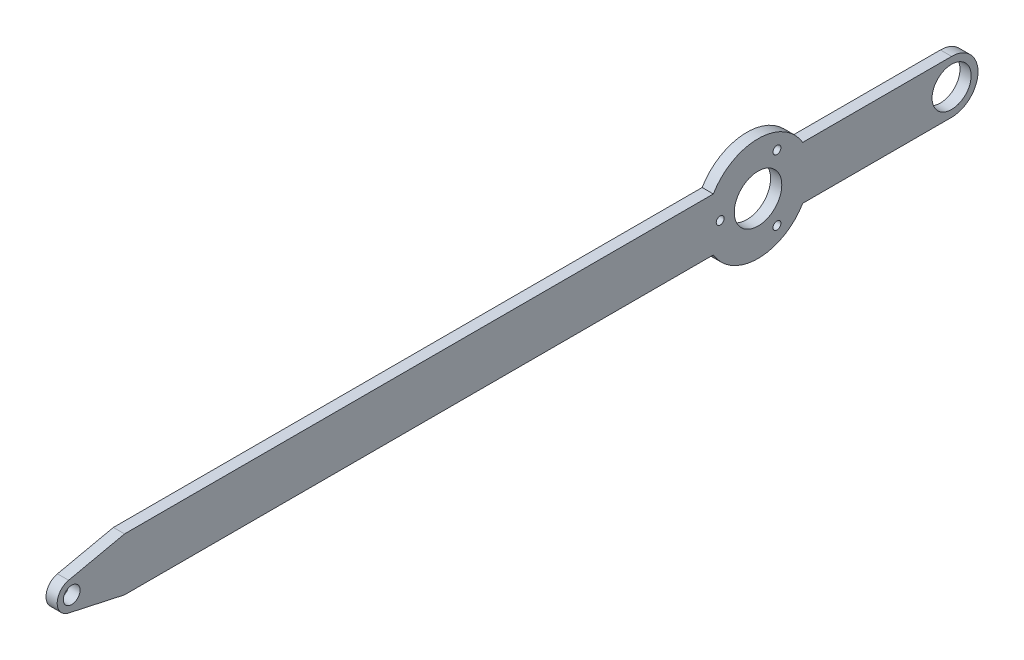
ISO-10303-21;
HEADER;
FILE_DESCRIPTION(('STEP AP214'),'2;1');
FILE_NAME('part.step','',(''),(''),'','','');
FILE_SCHEMA(('AUTOMOTIVE_DESIGN { 1 0 10303 214 1 1 1 1 }'));
ENDSEC;
DATA;
#1=APPLICATION_CONTEXT('core data for automotive mechanical design processes');
#2=APPLICATION_PROTOCOL_DEFINITION('international standard','automotive_design',2000,#1);
#3=PRODUCT_CONTEXT('',#1,'mechanical');
#4=PRODUCT('Part','Part','',(#3));
#5=PRODUCT_RELATED_PRODUCT_CATEGORY('part','',(#4));
#6=PRODUCT_DEFINITION_FORMATION('','',#4);
#7=PRODUCT_DEFINITION_CONTEXT('part definition',#1,'design');
#8=PRODUCT_DEFINITION('design','',#6,#7);
#9=PRODUCT_DEFINITION_SHAPE('','',#8);
#10=(LENGTH_UNIT() NAMED_UNIT(*) SI_UNIT(.MILLI.,.METRE.));
#11=(NAMED_UNIT(*) PLANE_ANGLE_UNIT() SI_UNIT($,.RADIAN.));
#12=(NAMED_UNIT(*) SI_UNIT($,.STERADIAN.) SOLID_ANGLE_UNIT());
#13=UNCERTAINTY_MEASURE_WITH_UNIT(LENGTH_MEASURE(1.E-05),#10,'distance_accuracy_value','');
#14=(GEOMETRIC_REPRESENTATION_CONTEXT(3) GLOBAL_UNCERTAINTY_ASSIGNED_CONTEXT((#13)) GLOBAL_UNIT_ASSIGNED_CONTEXT((#10,
#11,#12)) REPRESENTATION_CONTEXT('',''));
#15=CARTESIAN_POINT('',(0.,0.,0.));
#16=DIRECTION('',(0.,0.,1.));
#17=DIRECTION('',(1.,0.,0.));
#18=AXIS2_PLACEMENT_3D('',#15,#16,#17);
#19=CARTESIAN_POINT('',(3.175,112.17468780522,24.4662503709211));
#20=DIRECTION('',(0.,-0.977030682658923,-0.213098674662794));
#21=DIRECTION('',(0.,0.213098674662794,-0.977030682658923));
#22=AXIS2_PLACEMENT_3D('',#19,#20,#21);
#23=PLANE('',#22);
#24=DIRECTION('',(0.,-0.213098674662794,0.977030682658923));
#25=VECTOR('',#24,1.);
#26=CARTESIAN_POINT('',(-3.175,112.17468780522,24.4662503709211));
#27=LINE('',#26,#25);
#28=CARTESIAN_POINT('',(-3.175,15.,470.));
#29=VERTEX_POINT('',#28);
#30=CARTESIAN_POINT('',(-3.175,8.07271601546937,501.760727799401));
#31=VERTEX_POINT('',#30);
#32=EDGE_CURVE('E154',#29,#31,#27,.T.);
#33=ORIENTED_EDGE('',*,*,#32,.T.);
#34=DIRECTION('',(-1.,0.,0.));
#35=VECTOR('',#34,1.);
#36=CARTESIAN_POINT('',(3.175,8.07271601546937,501.760727799401));
#37=LINE('',#36,#35);
#38=CARTESIAN_POINT('',(3.175,8.07271601546937,501.760727799401));
#39=VERTEX_POINT('',#38);
#40=EDGE_CURVE('E11',#39,#31,#37,.T.);
#41=ORIENTED_EDGE('',*,*,#40,.F.);
#42=DIRECTION('',(0.,-0.213098674662794,0.977030682658923));
#43=VECTOR('',#42,1.);
#44=CARTESIAN_POINT('',(3.175,112.17468780522,24.4662503709211));
#45=LINE('',#44,#43);
#46=CARTESIAN_POINT('',(3.175,15.,470.));
#47=VERTEX_POINT('',#46);
#48=EDGE_CURVE('E228',#47,#39,#45,.T.);
#49=ORIENTED_EDGE('',*,*,#48,.F.);
#50=DIRECTION('',(-1.,0.,0.));
#51=VECTOR('',#50,1.);
#52=CARTESIAN_POINT('',(3.175,15.,470.));
#53=LINE('',#52,#51);
#54=EDGE_CURVE('E50',#47,#29,#53,.T.);
#55=ORIENTED_EDGE('',*,*,#54,.T.);
#56=EDGE_LOOP('',(#33,#41,#49,#55));
#57=FACE_BOUND('',#56,.T.);
#58=ADVANCED_FACE('F33',(#57),#23,.F.);
#59=CARTESIAN_POINT('',(3.175,0.,500.));
#60=DIRECTION('',(-1.,0.,0.));
#61=DIRECTION('',(0.,0.,1.));
#62=AXIS2_PLACEMENT_3D('',#59,#60,#61);
#63=CYLINDRICAL_SURFACE('',#62,8.26250000000001);
#64=CARTESIAN_POINT('',(-3.175,0.,500.));
#65=DIRECTION('',(1.,0.,0.));
#66=DIRECTION('',(0.,0.,-1.));
#67=AXIS2_PLACEMENT_3D('',#64,#65,#66);
#68=CIRCLE('',#67,8.26250000000001);
#69=CARTESIAN_POINT('',(-3.175,-8.07271601546936,501.760727799401));
#70=VERTEX_POINT('',#69);
#71=EDGE_CURVE('E157',#31,#70,#68,.T.);
#72=ORIENTED_EDGE('',*,*,#71,.T.);
#73=DIRECTION('',(-1.,0.,0.));
#74=VECTOR('',#73,1.);
#75=CARTESIAN_POINT('',(3.175,-8.07271601546936,501.760727799401));
#76=LINE('',#75,#74);
#77=CARTESIAN_POINT('',(3.175,-8.07271601546936,501.760727799401));
#78=VERTEX_POINT('',#77);
#79=EDGE_CURVE('E42',#78,#70,#76,.T.);
#80=ORIENTED_EDGE('',*,*,#79,.F.);
#81=CARTESIAN_POINT('',(3.175,0.,500.));
#82=DIRECTION('',(1.,0.,0.));
#83=DIRECTION('',(0.,0.,-1.));
#84=AXIS2_PLACEMENT_3D('',#81,#82,#83);
#85=CIRCLE('',#84,8.26250000000001);
#86=EDGE_CURVE('E95',#39,#78,#85,.T.);
#87=ORIENTED_EDGE('',*,*,#86,.F.);
#88=ORIENTED_EDGE('',*,*,#40,.T.);
#89=EDGE_LOOP('',(#72,#80,#87,#88));
#90=FACE_BOUND('',#89,.T.);
#91=ADVANCED_FACE('F204',(#90),#63,.T.);
#92=CARTESIAN_POINT('',(3.175,-112.17468780522,24.4662503709211));
#93=DIRECTION('',(0.,-0.977030682658923,0.213098674662795));
#94=DIRECTION('',(0.,-0.213098674662795,-0.977030682658923));
#95=AXIS2_PLACEMENT_3D('',#92,#93,#94);
#96=PLANE('',#95);
#97=DIRECTION('',(0.,0.213098674662795,0.977030682658923));
#98=VECTOR('',#97,1.);
#99=CARTESIAN_POINT('',(-3.175,-112.17468780522,24.4662503709211));
#100=LINE('',#99,#98);
#101=CARTESIAN_POINT('',(-3.175,-15.,470.));
#102=VERTEX_POINT('',#101);
#103=EDGE_CURVE('E160',#102,#70,#100,.T.);
#104=ORIENTED_EDGE('',*,*,#103,.F.);
#105=DIRECTION('',(-1.,0.,0.));
#106=VECTOR('',#105,1.);
#107=CARTESIAN_POINT('',(3.175,-15.,470.));
#108=LINE('',#107,#106);
#109=CARTESIAN_POINT('',(3.175,-15.,470.));
#110=VERTEX_POINT('',#109);
#111=EDGE_CURVE('E197',#110,#102,#108,.T.);
#112=ORIENTED_EDGE('',*,*,#111,.F.);
#113=DIRECTION('',(0.,0.213098674662795,0.977030682658923));
#114=VECTOR('',#113,1.);
#115=CARTESIAN_POINT('',(3.175,-112.17468780522,24.4662503709211));
#116=LINE('',#115,#114);
#117=EDGE_CURVE('E203',#110,#78,#116,.T.);
#118=ORIENTED_EDGE('',*,*,#117,.T.);
#119=ORIENTED_EDGE('',*,*,#79,.T.);
#120=EDGE_LOOP('',(#104,#112,#118,#119));
#121=FACE_BOUND('',#120,.T.);
#122=ADVANCED_FACE('F201',(#121),#96,.T.);
#123=CARTESIAN_POINT('',(3.175,-15.,0.));
#124=DIRECTION('',(0.,1.,0.));
#125=DIRECTION('',(0.,0.,1.));
#126=AXIS2_PLACEMENT_3D('',#123,#124,#125);
#127=PLANE('',#126);
#128=DIRECTION('',(0.,0.,-1.));
#129=VECTOR('',#128,1.);
#130=CARTESIAN_POINT('',(-3.175,-15.,0.));
#131=LINE('',#130,#129);
#132=CARTESIAN_POINT('',(-3.175,-15.,135.401771591761));
#133=VERTEX_POINT('',#132);
#134=EDGE_CURVE('E163',#102,#133,#131,.T.);
#135=ORIENTED_EDGE('',*,*,#134,.T.);
#136=DIRECTION('',(-1.,0.,0.));
#137=VECTOR('',#136,1.);
#138=CARTESIAN_POINT('',(3.175,-15.,135.401771591761));
#139=LINE('',#138,#137);
#140=CARTESIAN_POINT('',(3.175,-15.,135.401771591761));
#141=VERTEX_POINT('',#140);
#142=EDGE_CURVE('E194',#141,#133,#139,.T.);
#143=ORIENTED_EDGE('',*,*,#142,.F.);
#144=DIRECTION('',(0.,0.,-1.));
#145=VECTOR('',#144,1.);
#146=CARTESIAN_POINT('',(3.175,-15.,0.));
#147=LINE('',#146,#145);
#148=EDGE_CURVE('E222',#110,#141,#147,.T.);
#149=ORIENTED_EDGE('',*,*,#148,.F.);
#150=ORIENTED_EDGE('',*,*,#111,.T.);
#151=EDGE_LOOP('',(#135,#143,#149,#150));
#152=FACE_BOUND('',#151,.T.);
#153=ADVANCED_FACE('F214',(#152),#127,.F.);
#154=CARTESIAN_POINT('',(3.175,0.,110.));
#155=DIRECTION('',(-1.,0.,0.));
#156=DIRECTION('',(0.,0.,1.));
#157=AXIS2_PLACEMENT_3D('',#154,#155,#156);
#158=CYLINDRICAL_SURFACE('',#157,29.5);
#159=CARTESIAN_POINT('',(-3.175,0.,110.));
#160=DIRECTION('',(1.,0.,0.));
#161=DIRECTION('',(0.,0.,-1.));
#162=AXIS2_PLACEMENT_3D('',#159,#160,#161);
#163=CIRCLE('',#162,29.5);
#164=CARTESIAN_POINT('',(-3.175,-15.,84.5982284082389));
#165=VERTEX_POINT('',#164);
#166=EDGE_CURVE('E165',#133,#165,#163,.T.);
#167=ORIENTED_EDGE('',*,*,#166,.T.);
#168=DIRECTION('',(-1.,0.,0.));
#169=VECTOR('',#168,1.);
#170=CARTESIAN_POINT('',(3.175,-15.,84.5982284082389));
#171=LINE('',#170,#169);
#172=CARTESIAN_POINT('',(3.175,-15.,84.5982284082389));
#173=VERTEX_POINT('',#172);
#174=EDGE_CURVE('E191',#173,#165,#171,.T.);
#175=ORIENTED_EDGE('',*,*,#174,.F.);
#176=CARTESIAN_POINT('',(3.175,0.,110.));
#177=DIRECTION('',(1.,0.,0.));
#178=DIRECTION('',(0.,0.,-1.));
#179=AXIS2_PLACEMENT_3D('',#176,#177,#178);
#180=CIRCLE('',#179,29.5);
#181=EDGE_CURVE('E220',#141,#173,#180,.T.);
#182=ORIENTED_EDGE('',*,*,#181,.F.);
#183=ORIENTED_EDGE('',*,*,#142,.T.);
#184=EDGE_LOOP('',(#167,#175,#182,#183));
#185=FACE_BOUND('',#184,.T.);
#186=ADVANCED_FACE('F218',(#185),#158,.T.);
#187=CARTESIAN_POINT('',(3.175,-15.,0.));
#188=DIRECTION('',(0.,1.,0.));
#189=DIRECTION('',(0.,0.,1.));
#190=AXIS2_PLACEMENT_3D('',#187,#188,#189);
#191=PLANE('',#190);
#192=DIRECTION('',(0.,0.,-1.));
#193=VECTOR('',#192,1.);
#194=CARTESIAN_POINT('',(-3.175,-15.,0.));
#195=LINE('',#194,#193);
#196=CARTESIAN_POINT('',(-3.175,-15.,0.));
#197=VERTEX_POINT('',#196);
#198=EDGE_CURVE('E167',#165,#197,#195,.T.);
#199=ORIENTED_EDGE('',*,*,#198,.T.);
#200=DIRECTION('',(-1.,0.,0.));
#201=VECTOR('',#200,1.);
#202=CARTESIAN_POINT('',(3.175,-15.,0.));
#203=LINE('',#202,#201);
#204=CARTESIAN_POINT('',(3.175,-15.,0.));
#205=VERTEX_POINT('',#204);
#206=EDGE_CURVE('E189',#205,#197,#203,.T.);
#207=ORIENTED_EDGE('',*,*,#206,.F.);
#208=DIRECTION('',(0.,0.,-1.));
#209=VECTOR('',#208,1.);
#210=CARTESIAN_POINT('',(3.175,-15.,0.));
#211=LINE('',#210,#209);
#212=EDGE_CURVE('E140',#173,#205,#211,.T.);
#213=ORIENTED_EDGE('',*,*,#212,.F.);
#214=ORIENTED_EDGE('',*,*,#174,.T.);
#215=EDGE_LOOP('',(#199,#207,#213,#214));
#216=FACE_BOUND('',#215,.T.);
#217=ADVANCED_FACE('F291',(#216),#191,.F.);
#218=CARTESIAN_POINT('',(3.175,0.,0.));
#219=DIRECTION('',(-1.,0.,0.));
#220=DIRECTION('',(0.,0.,1.));
#221=AXIS2_PLACEMENT_3D('',#218,#219,#220);
#222=CYLINDRICAL_SURFACE('',#221,15.);
#223=CARTESIAN_POINT('',(-3.175,0.,0.));
#224=DIRECTION('',(1.,0.,0.));
#225=DIRECTION('',(0.,0.,-1.));
#226=AXIS2_PLACEMENT_3D('',#223,#224,#225);
#227=CIRCLE('',#226,15.);
#228=CARTESIAN_POINT('',(-3.175,15.,0.));
#229=VERTEX_POINT('',#228);
#230=EDGE_CURVE('E170',#229,#197,#227,.F.);
#231=ORIENTED_EDGE('',*,*,#230,.F.);
#232=DIRECTION('',(-1.,0.,0.));
#233=VECTOR('',#232,1.);
#234=CARTESIAN_POINT('',(3.175,15.,0.));
#235=LINE('',#234,#233);
#236=CARTESIAN_POINT('',(3.175,15.,0.));
#237=VERTEX_POINT('',#236);
#238=EDGE_CURVE('E126',#237,#229,#235,.T.);
#239=ORIENTED_EDGE('',*,*,#238,.F.);
#240=CARTESIAN_POINT('',(3.175,0.,0.));
#241=DIRECTION('',(1.,0.,0.));
#242=DIRECTION('',(0.,0.,-1.));
#243=AXIS2_PLACEMENT_3D('',#240,#241,#242);
#244=CIRCLE('',#243,15.);
#245=EDGE_CURVE('E138',#237,#205,#244,.F.);
#246=ORIENTED_EDGE('',*,*,#245,.T.);
#247=ORIENTED_EDGE('',*,*,#206,.T.);
#248=EDGE_LOOP('',(#231,#239,#246,#247));
#249=FACE_BOUND('',#248,.T.);
#250=ADVANCED_FACE('F294',(#249),#222,.T.);
#251=CARTESIAN_POINT('',(3.175,15.,0.));
#252=DIRECTION('',(0.,1.,0.));
#253=DIRECTION('',(0.,0.,1.));
#254=AXIS2_PLACEMENT_3D('',#251,#252,#253);
#255=PLANE('',#254);
#256=DIRECTION('',(0.,0.,-1.));
#257=VECTOR('',#256,1.);
#258=CARTESIAN_POINT('',(-3.175,15.,0.));
#259=LINE('',#258,#257);
#260=CARTESIAN_POINT('',(-3.175,15.,84.5982284082389));
#261=VERTEX_POINT('',#260);
#262=EDGE_CURVE('E123',#261,#229,#259,.T.);
#263=ORIENTED_EDGE('',*,*,#262,.F.);
#264=DIRECTION('',(-1.,0.,0.));
#265=VECTOR('',#264,1.);
#266=CARTESIAN_POINT('',(3.175,15.,84.5982284082389));
#267=LINE('',#266,#265);
#268=CARTESIAN_POINT('',(3.175,15.,84.5982284082389));
#269=VERTEX_POINT('',#268);
#270=EDGE_CURVE('E117',#269,#261,#267,.T.);
#271=ORIENTED_EDGE('',*,*,#270,.F.);
#272=DIRECTION('',(0.,0.,-1.));
#273=VECTOR('',#272,1.);
#274=CARTESIAN_POINT('',(3.175,15.,0.));
#275=LINE('',#274,#273);
#276=EDGE_CURVE('E121',#269,#237,#275,.T.);
#277=ORIENTED_EDGE('',*,*,#276,.T.);
#278=ORIENTED_EDGE('',*,*,#238,.T.);
#279=EDGE_LOOP('',(#263,#271,#277,#278));
#280=FACE_BOUND('',#279,.T.);
#281=ADVANCED_FACE('F119',(#280),#255,.T.);
#282=CARTESIAN_POINT('',(3.175,0.,110.));
#283=DIRECTION('',(-1.,0.,0.));
#284=DIRECTION('',(0.,0.,1.));
#285=AXIS2_PLACEMENT_3D('',#282,#283,#284);
#286=CYLINDRICAL_SURFACE('',#285,29.5);
#287=CARTESIAN_POINT('',(-3.175,0.,110.));
#288=DIRECTION('',(1.,0.,0.));
#289=DIRECTION('',(0.,0.,-1.));
#290=AXIS2_PLACEMENT_3D('',#287,#288,#289);
#291=CIRCLE('',#290,29.5);
#292=CARTESIAN_POINT('',(-3.175,15.,135.401771591761));
#293=VERTEX_POINT('',#292);
#294=EDGE_CURVE('E174',#261,#293,#291,.T.);
#295=ORIENTED_EDGE('',*,*,#294,.T.);
#296=DIRECTION('',(-1.,0.,0.));
#297=VECTOR('',#296,1.);
#298=CARTESIAN_POINT('',(3.175,15.,135.401771591761));
#299=LINE('',#298,#297);
#300=CARTESIAN_POINT('',(3.175,15.,135.401771591761));
#301=VERTEX_POINT('',#300);
#302=EDGE_CURVE('E83',#301,#293,#299,.T.);
#303=ORIENTED_EDGE('',*,*,#302,.F.);
#304=CARTESIAN_POINT('',(3.175,0.,110.));
#305=DIRECTION('',(1.,0.,0.));
#306=DIRECTION('',(0.,0.,-1.));
#307=AXIS2_PLACEMENT_3D('',#304,#305,#306);
#308=CIRCLE('',#307,29.5);
#309=EDGE_CURVE('E128',#269,#301,#308,.T.);
#310=ORIENTED_EDGE('',*,*,#309,.F.);
#311=ORIENTED_EDGE('',*,*,#270,.T.);
#312=EDGE_LOOP('',(#295,#303,#310,#311));
#313=FACE_BOUND('',#312,.T.);
#314=ADVANCED_FACE('F129',(#313),#286,.T.);
#315=CARTESIAN_POINT('',(3.175,0.,110.));
#316=DIRECTION('',(-1.,0.,0.));
#317=DIRECTION('',(0.,0.,1.));
#318=AXIS2_PLACEMENT_3D('',#315,#316,#317);
#319=CYLINDRICAL_SURFACE('',#318,13.5);
#320=CARTESIAN_POINT('',(3.175,0.,110.));
#321=DIRECTION('',(1.,0.,0.));
#322=DIRECTION('',(0.,0.,-1.));
#323=AXIS2_PLACEMENT_3D('',#320,#321,#322);
#324=CIRCLE('',#323,13.5);
#325=CARTESIAN_POINT('',(3.175,0.,96.5));
#326=VERTEX_POINT('',#325);
#327=EDGE_CURVE('E145',#326,#326,#324,.T.);
#328=ORIENTED_EDGE('',*,*,#327,.T.);
#329=EDGE_LOOP('',(#328));
#330=FACE_BOUND('',#329,.T.);
#331=CARTESIAN_POINT('',(-3.175,0.,110.));
#332=DIRECTION('',(1.,0.,0.));
#333=DIRECTION('',(0.,0.,-1.));
#334=AXIS2_PLACEMENT_3D('',#331,#332,#333);
#335=CIRCLE('',#334,13.5);
#336=CARTESIAN_POINT('',(-3.175,0.,96.5));
#337=VERTEX_POINT('',#336);
#338=EDGE_CURVE('E179',#337,#337,#335,.T.);
#339=ORIENTED_EDGE('',*,*,#338,.F.);
#340=EDGE_LOOP('',(#339));
#341=FACE_BOUND('',#340,.T.);
#342=ADVANCED_FACE('F303',(#330,#341),#319,.F.);
#343=CARTESIAN_POINT('',(3.175,15.,0.));
#344=DIRECTION('',(0.,1.,0.));
#345=DIRECTION('',(0.,0.,1.));
#346=AXIS2_PLACEMENT_3D('',#343,#344,#345);
#347=PLANE('',#346);
#348=DIRECTION('',(0.,0.,-1.));
#349=VECTOR('',#348,1.);
#350=CARTESIAN_POINT('',(-3.175,15.,0.));
#351=LINE('',#350,#349);
#352=EDGE_CURVE('E176',#29,#293,#351,.T.);
#353=ORIENTED_EDGE('',*,*,#352,.F.);
#354=ORIENTED_EDGE('',*,*,#54,.F.);
#355=DIRECTION('',(0.,0.,-1.));
#356=VECTOR('',#355,1.);
#357=CARTESIAN_POINT('',(3.175,15.,0.));
#358=LINE('',#357,#356);
#359=EDGE_CURVE('E132',#47,#301,#358,.T.);
#360=ORIENTED_EDGE('',*,*,#359,.T.);
#361=ORIENTED_EDGE('',*,*,#302,.T.);
#362=EDGE_LOOP('',(#353,#354,#360,#361));
#363=FACE_BOUND('',#362,.T.);
#364=ADVANCED_FACE('F264',(#363),#347,.T.);
#365=CARTESIAN_POINT('',(3.175,0.,500.));
#366=DIRECTION('',(-1.,0.,0.));
#367=DIRECTION('',(0.,0.,1.));
#368=AXIS2_PLACEMENT_3D('',#365,#366,#367);
#369=CYLINDRICAL_SURFACE('',#368,4.76250000000001);
#370=CARTESIAN_POINT('',(3.175,0.,500.));
#371=DIRECTION('',(1.,0.,0.));
#372=DIRECTION('',(0.,0.,-1.));
#373=AXIS2_PLACEMENT_3D('',#370,#371,#372);
#374=CIRCLE('',#373,4.76250000000001);
#375=CARTESIAN_POINT('',(3.175,0.,495.2375));
#376=VERTEX_POINT('',#375);
#377=EDGE_CURVE('E185',#376,#376,#374,.T.);
#378=ORIENTED_EDGE('',*,*,#377,.T.);
#379=EDGE_LOOP('',(#378));
#380=FACE_BOUND('',#379,.T.);
#381=CARTESIAN_POINT('',(-3.175,0.,500.));
#382=DIRECTION('',(1.,0.,0.));
#383=DIRECTION('',(0.,0.,-1.));
#384=AXIS2_PLACEMENT_3D('',#381,#382,#383);
#385=CIRCLE('',#384,4.76250000000001);
#386=CARTESIAN_POINT('',(-3.175,0.,495.2375));
#387=VERTEX_POINT('',#386);
#388=EDGE_CURVE('E151',#387,#387,#385,.T.);
#389=ORIENTED_EDGE('',*,*,#388,.F.);
#390=EDGE_LOOP('',(#389));
#391=FACE_BOUND('',#390,.T.);
#392=ADVANCED_FACE('F35',(#380,#391),#369,.F.);
#393=CARTESIAN_POINT('',(3.175,0.,0.));
#394=DIRECTION('',(-1.,0.,0.));
#395=DIRECTION('',(0.,0.,1.));
#396=AXIS2_PLACEMENT_3D('',#393,#394,#395);
#397=CYLINDRICAL_SURFACE('',#396,11.1125);
#398=CARTESIAN_POINT('',(3.175,0.,0.));
#399=DIRECTION('',(1.,0.,0.));
#400=DIRECTION('',(0.,0.,-1.));
#401=AXIS2_PLACEMENT_3D('',#398,#399,#400);
#402=CIRCLE('',#401,11.1125);
#403=CARTESIAN_POINT('',(3.175,0.,-11.1125));
#404=VERTEX_POINT('',#403);
#405=EDGE_CURVE('E148',#404,#404,#402,.T.);
#406=ORIENTED_EDGE('',*,*,#405,.T.);
#407=EDGE_LOOP('',(#406));
#408=FACE_BOUND('',#407,.T.);
#409=CARTESIAN_POINT('',(-3.175,0.,0.));
#410=DIRECTION('',(1.,0.,0.));
#411=DIRECTION('',(0.,0.,-1.));
#412=AXIS2_PLACEMENT_3D('',#409,#410,#411);
#413=CIRCLE('',#412,11.1125);
#414=CARTESIAN_POINT('',(-3.175,0.,-11.1125));
#415=VERTEX_POINT('',#414);
#416=EDGE_CURVE('E182',#415,#415,#413,.T.);
#417=ORIENTED_EDGE('',*,*,#416,.F.);
#418=EDGE_LOOP('',(#417));
#419=FACE_BOUND('',#418,.T.);
#420=ADVANCED_FACE('F254',(#408,#419),#397,.F.);
#421=CARTESIAN_POINT('',(3.175,0.,0.));
#422=DIRECTION('',(1.,0.,0.));
#423=DIRECTION('',(0.,0.,-1.));
#424=AXIS2_PLACEMENT_3D('',#421,#422,#423);
#425=PLANE('',#424);
#426=CARTESIAN_POINT('',(3.175,0.,131.5));
#427=DIRECTION('',(1.,0.,0.));
#428=DIRECTION('',(0.,0.,-1.));
#429=AXIS2_PLACEMENT_3D('',#426,#427,#428);
#430=CIRCLE('',#429,2.25);
#431=CARTESIAN_POINT('',(3.175,0.,129.25));
#432=VERTEX_POINT('',#431);
#433=EDGE_CURVE('E246',#432,#432,#430,.T.);
#434=ORIENTED_EDGE('',*,*,#433,.F.);
#435=EDGE_LOOP('',(#434));
#436=FACE_BOUND('',#435,.T.);
#437=CARTESIAN_POINT('',(3.175,18.6195461813654,99.25));
#438=DIRECTION('',(1.,0.,0.));
#439=DIRECTION('',(0.,0.,-1.));
#440=AXIS2_PLACEMENT_3D('',#437,#438,#439);
#441=CIRCLE('',#440,2.25);
#442=CARTESIAN_POINT('',(3.175,18.6195461813654,97.));
#443=VERTEX_POINT('',#442);
#444=EDGE_CURVE('E240',#443,#443,#441,.T.);
#445=ORIENTED_EDGE('',*,*,#444,.F.);
#446=EDGE_LOOP('',(#445));
#447=FACE_BOUND('',#446,.T.);
#448=CARTESIAN_POINT('',(3.175,-18.6195461813654,99.25));
#449=DIRECTION('',(1.,0.,0.));
#450=DIRECTION('',(0.,0.,-1.));
#451=AXIS2_PLACEMENT_3D('',#448,#449,#450);
#452=CIRCLE('',#451,2.25);
#453=CARTESIAN_POINT('',(3.175,-18.6195461813654,97.));
#454=VERTEX_POINT('',#453);
#455=EDGE_CURVE('E234',#454,#454,#452,.T.);
#456=ORIENTED_EDGE('',*,*,#455,.F.);
#457=EDGE_LOOP('',(#456));
#458=FACE_BOUND('',#457,.T.);
#459=ORIENTED_EDGE('',*,*,#377,.F.);
#460=EDGE_LOOP('',(#459));
#461=FACE_BOUND('',#460,.T.);
#462=ORIENTED_EDGE('',*,*,#48,.T.);
#463=ORIENTED_EDGE('',*,*,#86,.T.);
#464=ORIENTED_EDGE('',*,*,#117,.F.);
#465=ORIENTED_EDGE('',*,*,#148,.T.);
#466=ORIENTED_EDGE('',*,*,#181,.T.);
#467=ORIENTED_EDGE('',*,*,#212,.T.);
#468=ORIENTED_EDGE('',*,*,#245,.F.);
#469=ORIENTED_EDGE('',*,*,#276,.F.);
#470=ORIENTED_EDGE('',*,*,#309,.T.);
#471=ORIENTED_EDGE('',*,*,#359,.F.);
#472=EDGE_LOOP('',(#462,#463,#464,#465,#466,#467,#468,#469,#470,#471));
#473=FACE_BOUND('',#472,.T.);
#474=ORIENTED_EDGE('',*,*,#327,.F.);
#475=EDGE_LOOP('',(#474));
#476=FACE_BOUND('',#475,.T.);
#477=ORIENTED_EDGE('',*,*,#405,.F.);
#478=EDGE_LOOP('',(#477));
#479=FACE_BOUND('',#478,.T.);
#480=ADVANCED_FACE('F135',(#436,#447,#458,#461,#473,#476,#479),#425,.T.);
#481=CARTESIAN_POINT('',(-3.175,0.,0.));
#482=DIRECTION('',(1.,0.,0.));
#483=DIRECTION('',(0.,0.,-1.));
#484=AXIS2_PLACEMENT_3D('',#481,#482,#483);
#485=PLANE('',#484);
#486=CARTESIAN_POINT('',(-3.175,0.,131.5));
#487=DIRECTION('',(1.,0.,0.));
#488=DIRECTION('',(0.,0.,-1.));
#489=AXIS2_PLACEMENT_3D('',#486,#487,#488);
#490=CIRCLE('',#489,2.25);
#491=CARTESIAN_POINT('',(-3.175,0.,129.25));
#492=VERTEX_POINT('',#491);
#493=EDGE_CURVE('E243',#492,#492,#490,.T.);
#494=ORIENTED_EDGE('',*,*,#493,.T.);
#495=EDGE_LOOP('',(#494));
#496=FACE_BOUND('',#495,.T.);
#497=CARTESIAN_POINT('',(-3.175,18.6195461813654,99.25));
#498=DIRECTION('',(1.,0.,0.));
#499=DIRECTION('',(0.,0.,-1.));
#500=AXIS2_PLACEMENT_3D('',#497,#498,#499);
#501=CIRCLE('',#500,2.25);
#502=CARTESIAN_POINT('',(-3.175,18.6195461813654,97.));
#503=VERTEX_POINT('',#502);
#504=EDGE_CURVE('E237',#503,#503,#501,.T.);
#505=ORIENTED_EDGE('',*,*,#504,.T.);
#506=EDGE_LOOP('',(#505));
#507=FACE_BOUND('',#506,.T.);
#508=CARTESIAN_POINT('',(-3.175,-18.6195461813654,99.25));
#509=DIRECTION('',(1.,0.,0.));
#510=DIRECTION('',(0.,0.,-1.));
#511=AXIS2_PLACEMENT_3D('',#508,#509,#510);
#512=CIRCLE('',#511,2.25);
#513=CARTESIAN_POINT('',(-3.175,-18.6195461813654,97.));
#514=VERTEX_POINT('',#513);
#515=EDGE_CURVE('E155',#514,#514,#512,.T.);
#516=ORIENTED_EDGE('',*,*,#515,.T.);
#517=EDGE_LOOP('',(#516));
#518=FACE_BOUND('',#517,.T.);
#519=ORIENTED_EDGE('',*,*,#388,.T.);
#520=EDGE_LOOP('',(#519));
#521=FACE_BOUND('',#520,.T.);
#522=ORIENTED_EDGE('',*,*,#32,.F.);
#523=ORIENTED_EDGE('',*,*,#352,.T.);
#524=ORIENTED_EDGE('',*,*,#294,.F.);
#525=ORIENTED_EDGE('',*,*,#262,.T.);
#526=ORIENTED_EDGE('',*,*,#230,.T.);
#527=ORIENTED_EDGE('',*,*,#198,.F.);
#528=ORIENTED_EDGE('',*,*,#166,.F.);
#529=ORIENTED_EDGE('',*,*,#134,.F.);
#530=ORIENTED_EDGE('',*,*,#103,.T.);
#531=ORIENTED_EDGE('',*,*,#71,.F.);
#532=EDGE_LOOP('',(#522,#523,#524,#525,#526,#527,#528,#529,#530,#531));
#533=FACE_BOUND('',#532,.T.);
#534=ORIENTED_EDGE('',*,*,#338,.T.);
#535=EDGE_LOOP('',(#534));
#536=FACE_BOUND('',#535,.T.);
#537=ORIENTED_EDGE('',*,*,#416,.T.);
#538=EDGE_LOOP('',(#537));
#539=FACE_BOUND('',#538,.T.);
#540=ADVANCED_FACE('F208',(#496,#507,#518,#521,#533,#536,#539),#485,.F.);
#541=CARTESIAN_POINT('',(3.175,-18.6195461813654,99.25));
#542=DIRECTION('',(1.,0.,0.));
#543=DIRECTION('',(0.,0.,-1.));
#544=AXIS2_PLACEMENT_3D('',#541,#542,#543);
#545=CYLINDRICAL_SURFACE('',#544,2.25);
#546=ORIENTED_EDGE('',*,*,#515,.F.);
#547=EDGE_LOOP('',(#546));
#548=FACE_BOUND('',#547,.T.);
#549=ORIENTED_EDGE('',*,*,#455,.T.);
#550=EDGE_LOOP('',(#549));
#551=FACE_BOUND('',#550,.T.);
#552=ADVANCED_FACE('F268',(#548,#551),#545,.F.);
#553=CARTESIAN_POINT('',(3.175,18.6195461813654,99.25));
#554=DIRECTION('',(1.,0.,0.));
#555=DIRECTION('',(0.,0.,-1.));
#556=AXIS2_PLACEMENT_3D('',#553,#554,#555);
#557=CYLINDRICAL_SURFACE('',#556,2.25);
#558=ORIENTED_EDGE('',*,*,#504,.F.);
#559=EDGE_LOOP('',(#558));
#560=FACE_BOUND('',#559,.T.);
#561=ORIENTED_EDGE('',*,*,#444,.T.);
#562=EDGE_LOOP('',(#561));
#563=FACE_BOUND('',#562,.T.);
#564=ADVANCED_FACE('F274',(#560,#563),#557,.F.);
#565=CARTESIAN_POINT('',(3.175,0.,131.5));
#566=DIRECTION('',(1.,0.,0.));
#567=DIRECTION('',(0.,0.,-1.));
#568=AXIS2_PLACEMENT_3D('',#565,#566,#567);
#569=CYLINDRICAL_SURFACE('',#568,2.25);
#570=ORIENTED_EDGE('',*,*,#493,.F.);
#571=EDGE_LOOP('',(#570));
#572=FACE_BOUND('',#571,.T.);
#573=ORIENTED_EDGE('',*,*,#433,.T.);
#574=EDGE_LOOP('',(#573));
#575=FACE_BOUND('',#574,.T.);
#576=ADVANCED_FACE('F250',(#572,#575),#569,.F.);
#577=CLOSED_SHELL('',(#58,#91,#122,#153,#186,#217,#250,#281,#314,#342,#364,#392,#420,#480,#540,
#552,#564,#576));
#578=MANIFOLD_SOLID_BREP('B2',#577);
#579=ADVANCED_BREP_SHAPE_REPRESENTATION('',(#18,#578),#14);
#580=SHAPE_DEFINITION_REPRESENTATION(#9,#579);
ENDSEC;
END-ISO-10303-21;
